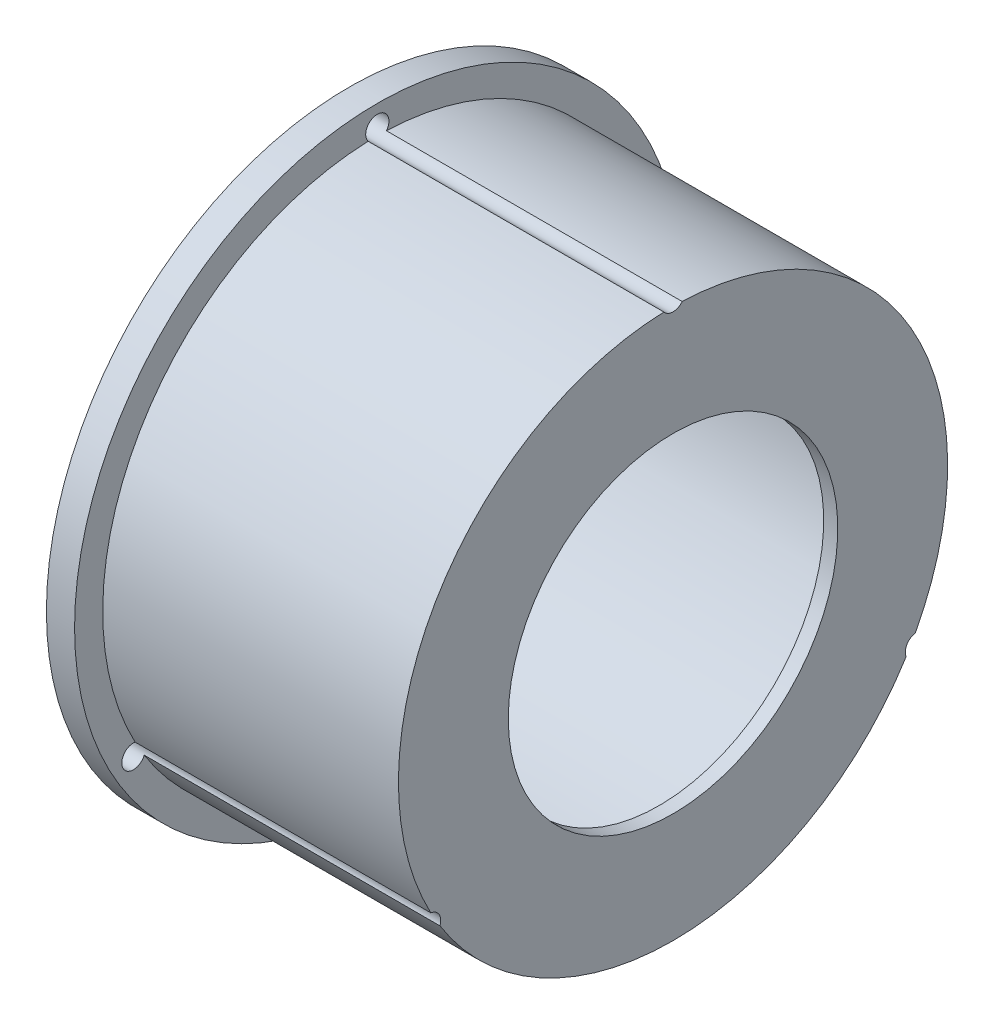
ISO-10303-21;
HEADER;
FILE_DESCRIPTION(('STEP AP214'),'2;1');
FILE_NAME('part.step','',(''),(''),'','','');
FILE_SCHEMA(('AUTOMOTIVE_DESIGN { 1 0 10303 214 1 1 1 1 }'));
ENDSEC;
DATA;
#1=APPLICATION_CONTEXT('core data for automotive mechanical design processes');
#2=APPLICATION_PROTOCOL_DEFINITION('international standard','automotive_design',2000,#1);
#3=PRODUCT_CONTEXT('',#1,'mechanical');
#4=PRODUCT('Part','Part','',(#3));
#5=PRODUCT_RELATED_PRODUCT_CATEGORY('part','',(#4));
#6=PRODUCT_DEFINITION_FORMATION('','',#4);
#7=PRODUCT_DEFINITION_CONTEXT('part definition',#1,'design');
#8=PRODUCT_DEFINITION('design','',#6,#7);
#9=PRODUCT_DEFINITION_SHAPE('','',#8);
#10=(LENGTH_UNIT() NAMED_UNIT(*) SI_UNIT(.MILLI.,.METRE.));
#11=(NAMED_UNIT(*) PLANE_ANGLE_UNIT() SI_UNIT($,.RADIAN.));
#12=(NAMED_UNIT(*) SI_UNIT($,.STERADIAN.) SOLID_ANGLE_UNIT());
#13=UNCERTAINTY_MEASURE_WITH_UNIT(LENGTH_MEASURE(1.E-05),#10,'distance_accuracy_value','');
#14=(GEOMETRIC_REPRESENTATION_CONTEXT(3) GLOBAL_UNCERTAINTY_ASSIGNED_CONTEXT((#13)) GLOBAL_UNIT_ASSIGNED_CONTEXT((#10,
#11,#12)) REPRESENTATION_CONTEXT('',''));
#15=CARTESIAN_POINT('',(0.,0.,0.));
#16=DIRECTION('',(0.,0.,1.));
#17=DIRECTION('',(1.,0.,0.));
#18=AXIS2_PLACEMENT_3D('',#15,#16,#17);
#19=CARTESIAN_POINT('',(-110.,0.,0.));
#20=DIRECTION('',(-1.,0.,0.));
#21=DIRECTION('',(0.,0.,1.));
#22=AXIS2_PLACEMENT_3D('',#19,#20,#21);
#23=CYLINDRICAL_SURFACE('',#22,39.);
#24=DIRECTION('',(-1.,0.,0.));
#25=VECTOR('',#24,1.);
#26=CARTESIAN_POINT('',(90.85,38.9784687500001,-1.29575225458943));
#27=LINE('',#26,#25);
#28=CARTESIAN_POINT('',(181.7,38.97846875,-1.29575225458937));
#29=VERTEX_POINT('',#28);
#30=CARTESIAN_POINT('',(139.7,38.97846875,-1.29575225458954));
#31=VERTEX_POINT('',#30);
#32=EDGE_CURVE('E117',#29,#31,#27,.T.);
#33=ORIENTED_EDGE('',*,*,#32,.F.);
#34=CARTESIAN_POINT('',(181.7,0.,0.));
#35=DIRECTION('',(-1.,0.,0.));
#36=DIRECTION('',(0.,0.,1.));
#37=AXIS2_PLACEMENT_3D('',#34,#35,#36);
#38=CIRCLE('',#37,39.);
#39=CARTESIAN_POINT('',(181.7,-18.3670800055147,-34.4042202654125));
#40=VERTEX_POINT('',#39);
#41=EDGE_CURVE('E109',#29,#40,#38,.T.);
#42=ORIENTED_EDGE('',*,*,#41,.T.);
#43=DIRECTION('',(-1.,0.,0.));
#44=VECTOR('',#43,1.);
#45=CARTESIAN_POINT('',(90.85,-18.3670800055146,-34.4042202654126));
#46=LINE('',#45,#44);
#47=CARTESIAN_POINT('',(139.7,-18.3670800055145,-34.4042202654126));
#48=VERTEX_POINT('',#47);
#49=EDGE_CURVE('E90',#48,#40,#46,.F.);
#50=ORIENTED_EDGE('',*,*,#49,.F.);
#51=CARTESIAN_POINT('',(139.7,0.,0.));
#52=DIRECTION('',(-1.,0.,0.));
#53=DIRECTION('',(0.,0.,1.));
#54=AXIS2_PLACEMENT_3D('',#51,#52,#53);
#55=CIRCLE('',#54,39.);
#56=EDGE_CURVE('E130',#31,#48,#55,.T.);
#57=ORIENTED_EDGE('',*,*,#56,.F.);
#58=EDGE_LOOP('',(#33,#42,#50,#57));
#59=FACE_BOUND('',#58,.T.);
#60=ADVANCED_FACE('F39',(#59),#23,.T.);
#61=DIRECTION('',(-1.,0.,0.));
#62=VECTOR('',#61,1.);
#63=CARTESIAN_POINT('',(90.85,38.9784687500001,1.29575225458943));
#64=LINE('',#63,#62);
#65=CARTESIAN_POINT('',(139.7,38.97846875,1.29575225458954));
#66=VERTEX_POINT('',#65);
#67=CARTESIAN_POINT('',(181.7,38.97846875,1.29575225458937));
#68=VERTEX_POINT('',#67);
#69=EDGE_CURVE('E161',#66,#68,#64,.F.);
#70=ORIENTED_EDGE('',*,*,#69,.F.);
#71=CARTESIAN_POINT('',(139.7,-18.3670800055145,34.4042202654126));
#72=VERTEX_POINT('',#71);
#73=EDGE_CURVE('E136',#72,#66,#55,.T.);
#74=ORIENTED_EDGE('',*,*,#73,.F.);
#75=DIRECTION('',(-1.,0.,0.));
#76=VECTOR('',#75,1.);
#77=CARTESIAN_POINT('',(90.85,-18.3670800055146,34.4042202654127));
#78=LINE('',#77,#76);
#79=CARTESIAN_POINT('',(181.7,-18.3670800055146,34.4042202654126));
#80=VERTEX_POINT('',#79);
#81=EDGE_CURVE('E55',#80,#72,#78,.T.);
#82=ORIENTED_EDGE('',*,*,#81,.F.);
#83=EDGE_CURVE('E121',#80,#68,#38,.T.);
#84=ORIENTED_EDGE('',*,*,#83,.T.);
#85=EDGE_LOOP('',(#70,#74,#82,#84));
#86=FACE_BOUND('',#85,.T.);
#87=ADVANCED_FACE('F236',(#86),#23,.T.);
#88=DIRECTION('',(-1.,0.,0.));
#89=VECTOR('',#88,1.);
#90=CARTESIAN_POINT('',(90.85,-20.6113887444854,33.1084680108232));
#91=LINE('',#90,#89);
#92=CARTESIAN_POINT('',(139.7,-20.6113887444855,33.1084680108231));
#93=VERTEX_POINT('',#92);
#94=CARTESIAN_POINT('',(181.7,-20.6113887444853,33.1084680108232));
#95=VERTEX_POINT('',#94);
#96=EDGE_CURVE('E170',#93,#95,#91,.F.);
#97=ORIENTED_EDGE('',*,*,#96,.F.);
#98=CARTESIAN_POINT('',(139.7,-20.6113887444855,-33.1084680108231));
#99=VERTEX_POINT('',#98);
#100=EDGE_CURVE('E135',#99,#93,#55,.T.);
#101=ORIENTED_EDGE('',*,*,#100,.F.);
#102=DIRECTION('',(-1.,0.,0.));
#103=VECTOR('',#102,1.);
#104=CARTESIAN_POINT('',(90.85,-20.6113887444855,-33.1084680108232));
#105=LINE('',#104,#103);
#106=CARTESIAN_POINT('',(181.7,-20.6113887444854,-33.1084680108232));
#107=VERTEX_POINT('',#106);
#108=EDGE_CURVE('E63',#107,#99,#105,.T.);
#109=ORIENTED_EDGE('',*,*,#108,.F.);
#110=EDGE_CURVE('E112',#107,#95,#38,.T.);
#111=ORIENTED_EDGE('',*,*,#110,.T.);
#112=EDGE_LOOP('',(#97,#101,#109,#111));
#113=FACE_BOUND('',#112,.T.);
#114=ADVANCED_FACE('F187',(#113),#23,.T.);
#115=CARTESIAN_POINT('',(135.7,43.,0.));
#116=DIRECTION('',(1.,0.,0.));
#117=DIRECTION('',(0.,0.,-1.));
#118=AXIS2_PLACEMENT_3D('',#115,#116,#117);
#119=PLANE('',#118);
#120=CARTESIAN_POINT('',(135.7,40.,0.));
#121=DIRECTION('',(1.,0.,0.));
#122=DIRECTION('',(0.,0.,-1.));
#123=AXIS2_PLACEMENT_3D('',#120,#121,#122);
#124=CIRCLE('',#123,1.65);
#125=CARTESIAN_POINT('',(135.7,40.,-1.65));
#126=VERTEX_POINT('',#125);
#127=EDGE_CURVE('E153',#126,#126,#124,.F.);
#128=ORIENTED_EDGE('',*,*,#127,.F.);
#129=EDGE_LOOP('',(#128));
#130=FACE_BOUND('',#129,.T.);
#131=CARTESIAN_POINT('',(135.7,-20.,34.6410161513775));
#132=DIRECTION('',(1.,0.,0.));
#133=DIRECTION('',(0.,0.,-1.));
#134=AXIS2_PLACEMENT_3D('',#131,#132,#133);
#135=CIRCLE('',#134,1.65);
#136=CARTESIAN_POINT('',(135.7,-20.,32.9910161513776));
#137=VERTEX_POINT('',#136);
#138=EDGE_CURVE('E164',#137,#137,#135,.F.);
#139=ORIENTED_EDGE('',*,*,#138,.F.);
#140=EDGE_LOOP('',(#139));
#141=FACE_BOUND('',#140,.T.);
#142=CARTESIAN_POINT('',(135.7,-20.,-34.6410161513775));
#143=DIRECTION('',(1.,0.,0.));
#144=DIRECTION('',(0.,0.,-1.));
#145=AXIS2_PLACEMENT_3D('',#142,#143,#144);
#146=CIRCLE('',#145,1.65);
#147=CARTESIAN_POINT('',(135.7,-20.,-36.2910161513775));
#148=VERTEX_POINT('',#147);
#149=EDGE_CURVE('E173',#148,#148,#146,.F.);
#150=ORIENTED_EDGE('',*,*,#149,.F.);
#151=EDGE_LOOP('',(#150));
#152=FACE_BOUND('',#151,.T.);
#153=CARTESIAN_POINT('',(135.7,0.,0.));
#154=DIRECTION('',(-1.,0.,0.));
#155=DIRECTION('',(0.,0.,1.));
#156=AXIS2_PLACEMENT_3D('',#153,#154,#155);
#157=CIRCLE('',#156,36.4);
#158=CARTESIAN_POINT('',(135.7,0.,36.4));
#159=VERTEX_POINT('',#158);
#160=EDGE_CURVE('E192',#159,#159,#157,.T.);
#161=ORIENTED_EDGE('',*,*,#160,.F.);
#162=EDGE_LOOP('',(#161));
#163=FACE_BOUND('',#162,.T.);
#164=CARTESIAN_POINT('',(135.7,0.,0.));
#165=DIRECTION('',(-1.,0.,0.));
#166=DIRECTION('',(0.,0.,1.));
#167=AXIS2_PLACEMENT_3D('',#164,#165,#166);
#168=CIRCLE('',#167,43.);
#169=CARTESIAN_POINT('',(135.7,0.,43.));
#170=VERTEX_POINT('',#169);
#171=EDGE_CURVE('E148',#170,#170,#168,.T.);
#172=ORIENTED_EDGE('',*,*,#171,.T.);
#173=EDGE_LOOP('',(#172));
#174=FACE_BOUND('',#173,.T.);
#175=ADVANCED_FACE('F41',(#130,#141,#152,#163,#174),#119,.F.);
#176=CARTESIAN_POINT('',(-110.,0.,0.));
#177=DIRECTION('',(-1.,0.,0.));
#178=DIRECTION('',(0.,0.,1.));
#179=AXIS2_PLACEMENT_3D('',#176,#177,#178);
#180=CYLINDRICAL_SURFACE('',#179,36.4);
#181=CARTESIAN_POINT('',(179.7,0.,0.));
#182=DIRECTION('',(-1.,0.,0.));
#183=DIRECTION('',(0.,0.,1.));
#184=AXIS2_PLACEMENT_3D('',#181,#182,#183);
#185=CIRCLE('',#184,36.4);
#186=CARTESIAN_POINT('',(179.7,0.,36.4));
#187=VERTEX_POINT('',#186);
#188=EDGE_CURVE('E197',#187,#187,#185,.T.);
#189=ORIENTED_EDGE('',*,*,#188,.F.);
#190=EDGE_LOOP('',(#189));
#191=FACE_BOUND('',#190,.T.);
#192=ORIENTED_EDGE('',*,*,#160,.T.);
#193=EDGE_LOOP('',(#192));
#194=FACE_BOUND('',#193,.T.);
#195=ADVANCED_FACE('F212',(#191,#194),#180,.F.);
#196=CARTESIAN_POINT('',(179.7,36.4,0.));
#197=DIRECTION('',(1.,0.,0.));
#198=DIRECTION('',(0.,0.,-1.));
#199=AXIS2_PLACEMENT_3D('',#196,#197,#198);
#200=PLANE('',#199);
#201=CARTESIAN_POINT('',(179.7,0.,0.));
#202=DIRECTION('',(-1.,0.,0.));
#203=DIRECTION('',(0.,0.,1.));
#204=AXIS2_PLACEMENT_3D('',#201,#202,#203);
#205=CIRCLE('',#204,23.4);
#206=CARTESIAN_POINT('',(179.7,0.,23.4));
#207=VERTEX_POINT('',#206);
#208=EDGE_CURVE('E125',#207,#207,#205,.T.);
#209=ORIENTED_EDGE('',*,*,#208,.F.);
#210=EDGE_LOOP('',(#209));
#211=FACE_BOUND('',#210,.T.);
#212=ORIENTED_EDGE('',*,*,#188,.T.);
#213=EDGE_LOOP('',(#212));
#214=FACE_BOUND('',#213,.T.);
#215=ADVANCED_FACE('F209',(#211,#214),#200,.F.);
#216=CARTESIAN_POINT('',(-110.,0.,0.));
#217=DIRECTION('',(-1.,0.,0.));
#218=DIRECTION('',(0.,0.,1.));
#219=AXIS2_PLACEMENT_3D('',#216,#217,#218);
#220=CYLINDRICAL_SURFACE('',#219,23.4);
#221=CARTESIAN_POINT('',(181.7,0.,0.));
#222=DIRECTION('',(-1.,0.,0.));
#223=DIRECTION('',(0.,0.,1.));
#224=AXIS2_PLACEMENT_3D('',#221,#222,#223);
#225=CIRCLE('',#224,23.4);
#226=CARTESIAN_POINT('',(181.7,0.,23.4));
#227=VERTEX_POINT('',#226);
#228=EDGE_CURVE('E119',#227,#227,#225,.T.);
#229=ORIENTED_EDGE('',*,*,#228,.F.);
#230=EDGE_LOOP('',(#229));
#231=FACE_BOUND('',#230,.T.);
#232=ORIENTED_EDGE('',*,*,#208,.T.);
#233=EDGE_LOOP('',(#232));
#234=FACE_BOUND('',#233,.T.);
#235=ADVANCED_FACE('F207',(#231,#234),#220,.F.);
#236=CARTESIAN_POINT('',(181.7,23.4,0.));
#237=DIRECTION('',(-1.,0.,0.));
#238=DIRECTION('',(0.,0.,1.));
#239=AXIS2_PLACEMENT_3D('',#236,#237,#238);
#240=PLANE('',#239);
#241=CARTESIAN_POINT('',(181.7,40.,0.));
#242=DIRECTION('',(1.,0.,0.));
#243=DIRECTION('',(0.,0.,-1.));
#244=AXIS2_PLACEMENT_3D('',#241,#242,#243);
#245=CIRCLE('',#244,1.65);
#246=EDGE_CURVE('E101',#68,#29,#245,.T.);
#247=ORIENTED_EDGE('',*,*,#246,.F.);
#248=ORIENTED_EDGE('',*,*,#83,.F.);
#249=CARTESIAN_POINT('',(181.7,-20.,34.6410161513775));
#250=DIRECTION('',(1.,0.,0.));
#251=DIRECTION('',(0.,0.,-1.));
#252=AXIS2_PLACEMENT_3D('',#249,#250,#251);
#253=CIRCLE('',#252,1.65);
#254=EDGE_CURVE('E114',#95,#80,#253,.T.);
#255=ORIENTED_EDGE('',*,*,#254,.F.);
#256=ORIENTED_EDGE('',*,*,#110,.F.);
#257=CARTESIAN_POINT('',(181.7,-20.,-34.6410161513775));
#258=DIRECTION('',(1.,0.,0.));
#259=DIRECTION('',(0.,0.,-1.));
#260=AXIS2_PLACEMENT_3D('',#257,#258,#259);
#261=CIRCLE('',#260,1.65);
#262=EDGE_CURVE('E94',#40,#107,#261,.T.);
#263=ORIENTED_EDGE('',*,*,#262,.F.);
#264=ORIENTED_EDGE('',*,*,#41,.F.);
#265=EDGE_LOOP('',(#247,#248,#255,#256,#263,#264));
#266=FACE_BOUND('',#265,.T.);
#267=ORIENTED_EDGE('',*,*,#228,.T.);
#268=EDGE_LOOP('',(#267));
#269=FACE_BOUND('',#268,.T.);
#270=ADVANCED_FACE('F107',(#266,#269),#240,.F.);
#271=CARTESIAN_POINT('',(139.7,39.,0.));
#272=DIRECTION('',(-1.,0.,0.));
#273=DIRECTION('',(0.,0.,1.));
#274=AXIS2_PLACEMENT_3D('',#271,#272,#273);
#275=PLANE('',#274);
#276=CARTESIAN_POINT('',(139.7,40.,0.));
#277=DIRECTION('',(-1.,0.,0.));
#278=DIRECTION('',(0.,0.,1.));
#279=AXIS2_PLACEMENT_3D('',#276,#277,#278);
#280=CIRCLE('',#279,1.65);
#281=EDGE_CURVE('E11',#31,#66,#280,.F.);
#282=ORIENTED_EDGE('',*,*,#281,.F.);
#283=ORIENTED_EDGE('',*,*,#56,.T.);
#284=CARTESIAN_POINT('',(139.7,-20.,-34.6410161513775));
#285=DIRECTION('',(-1.,0.,0.));
#286=DIRECTION('',(0.,0.,1.));
#287=AXIS2_PLACEMENT_3D('',#284,#285,#286);
#288=CIRCLE('',#287,1.65);
#289=EDGE_CURVE('E95',#99,#48,#288,.F.);
#290=ORIENTED_EDGE('',*,*,#289,.F.);
#291=ORIENTED_EDGE('',*,*,#100,.T.);
#292=CARTESIAN_POINT('',(139.7,-20.,34.6410161513775));
#293=DIRECTION('',(-1.,0.,0.));
#294=DIRECTION('',(0.,0.,1.));
#295=AXIS2_PLACEMENT_3D('',#292,#293,#294);
#296=CIRCLE('',#295,1.65);
#297=EDGE_CURVE('E48',#72,#93,#296,.F.);
#298=ORIENTED_EDGE('',*,*,#297,.F.);
#299=ORIENTED_EDGE('',*,*,#73,.T.);
#300=EDGE_LOOP('',(#282,#283,#290,#291,#298,#299));
#301=FACE_BOUND('',#300,.T.);
#302=CARTESIAN_POINT('',(139.7,0.,0.));
#303=DIRECTION('',(-1.,0.,0.));
#304=DIRECTION('',(0.,0.,1.));
#305=AXIS2_PLACEMENT_3D('',#302,#303,#304);
#306=CIRCLE('',#305,43.);
#307=CARTESIAN_POINT('',(139.7,0.,43.));
#308=VERTEX_POINT('',#307);
#309=EDGE_CURVE('E144',#308,#308,#306,.T.);
#310=ORIENTED_EDGE('',*,*,#309,.F.);
#311=EDGE_LOOP('',(#310));
#312=FACE_BOUND('',#311,.T.);
#313=ADVANCED_FACE('F189',(#301,#312),#275,.F.);
#314=CARTESIAN_POINT('',(-110.,0.,0.));
#315=DIRECTION('',(-1.,0.,0.));
#316=DIRECTION('',(0.,0.,1.));
#317=AXIS2_PLACEMENT_3D('',#314,#315,#316);
#318=CYLINDRICAL_SURFACE('',#317,43.);
#319=ORIENTED_EDGE('',*,*,#171,.F.);
#320=EDGE_LOOP('',(#319));
#321=FACE_BOUND('',#320,.T.);
#322=ORIENTED_EDGE('',*,*,#309,.T.);
#323=EDGE_LOOP('',(#322));
#324=FACE_BOUND('',#323,.T.);
#325=ADVANCED_FACE('F225',(#321,#324),#318,.T.);
#326=CARTESIAN_POINT('',(181.7,-20.,-34.6410161513775));
#327=DIRECTION('',(-1.,0.,0.));
#328=DIRECTION('',(0.,0.,1.));
#329=AXIS2_PLACEMENT_3D('',#326,#327,#328);
#330=CYLINDRICAL_SURFACE('',#329,1.65);
#331=ORIENTED_EDGE('',*,*,#108,.T.);
#332=ORIENTED_EDGE('',*,*,#289,.T.);
#333=ORIENTED_EDGE('',*,*,#49,.T.);
#334=ORIENTED_EDGE('',*,*,#262,.T.);
#335=EDGE_LOOP('',(#331,#332,#333,#334));
#336=FACE_BOUND('',#335,.T.);
#337=ORIENTED_EDGE('',*,*,#149,.T.);
#338=EDGE_LOOP('',(#337));
#339=FACE_BOUND('',#338,.T.);
#340=ADVANCED_FACE('F92',(#336,#339),#330,.F.);
#341=CARTESIAN_POINT('',(181.7,-20.,34.6410161513775));
#342=DIRECTION('',(-1.,0.,0.));
#343=DIRECTION('',(0.,0.,1.));
#344=AXIS2_PLACEMENT_3D('',#341,#342,#343);
#345=CYLINDRICAL_SURFACE('',#344,1.65);
#346=ORIENTED_EDGE('',*,*,#81,.T.);
#347=ORIENTED_EDGE('',*,*,#297,.T.);
#348=ORIENTED_EDGE('',*,*,#96,.T.);
#349=ORIENTED_EDGE('',*,*,#254,.T.);
#350=EDGE_LOOP('',(#346,#347,#348,#349));
#351=FACE_BOUND('',#350,.T.);
#352=ORIENTED_EDGE('',*,*,#138,.T.);
#353=EDGE_LOOP('',(#352));
#354=FACE_BOUND('',#353,.T.);
#355=ADVANCED_FACE('F232',(#351,#354),#345,.F.);
#356=CARTESIAN_POINT('',(181.7,40.,0.));
#357=DIRECTION('',(-1.,0.,0.));
#358=DIRECTION('',(0.,0.,1.));
#359=AXIS2_PLACEMENT_3D('',#356,#357,#358);
#360=CYLINDRICAL_SURFACE('',#359,1.65);
#361=ORIENTED_EDGE('',*,*,#32,.T.);
#362=ORIENTED_EDGE('',*,*,#281,.T.);
#363=ORIENTED_EDGE('',*,*,#69,.T.);
#364=ORIENTED_EDGE('',*,*,#246,.T.);
#365=EDGE_LOOP('',(#361,#362,#363,#364));
#366=FACE_BOUND('',#365,.T.);
#367=ORIENTED_EDGE('',*,*,#127,.T.);
#368=EDGE_LOOP('',(#367));
#369=FACE_BOUND('',#368,.T.);
#370=ADVANCED_FACE('F183',(#366,#369),#360,.F.);
#371=CLOSED_SHELL('',(#60,#87,#114,#175,#195,#215,#235,#270,#313,#325,#340,#355,#370));
#372=MANIFOLD_SOLID_BREP('B2',#371);
#373=ADVANCED_BREP_SHAPE_REPRESENTATION('',(#18,#372),#14);
#374=SHAPE_DEFINITION_REPRESENTATION(#9,#373);
ENDSEC;
END-ISO-10303-21;
